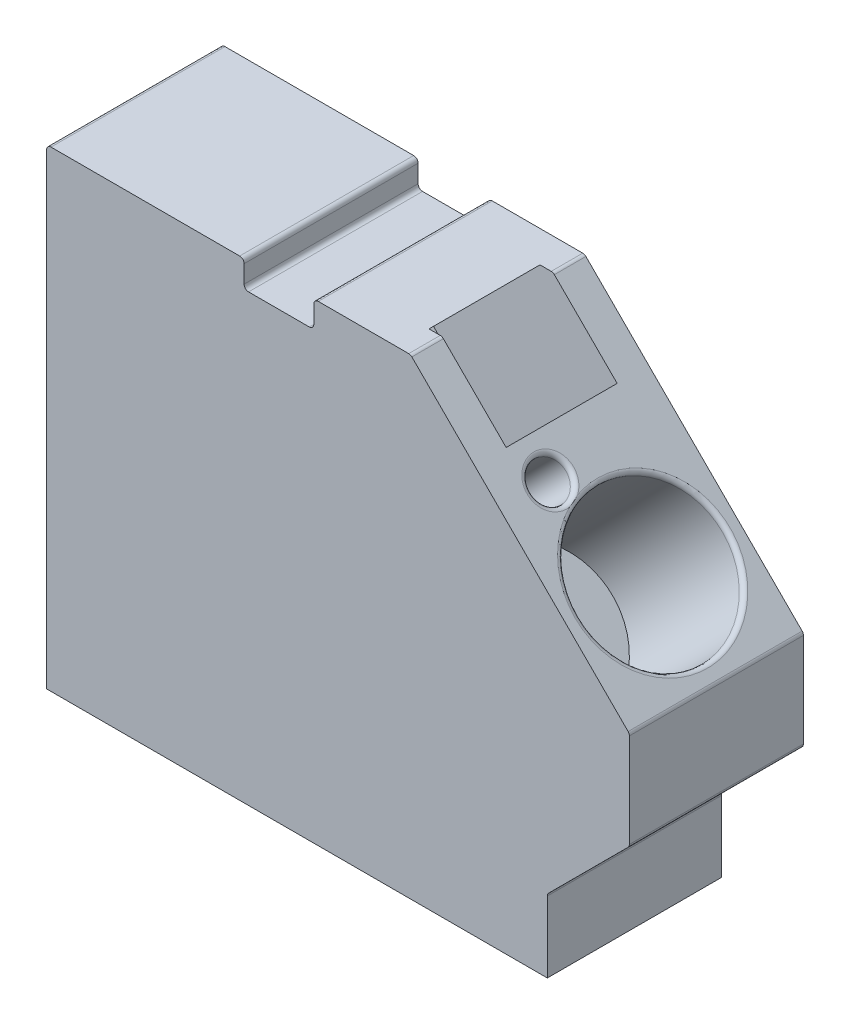
ISO-10303-21;
HEADER;
FILE_DESCRIPTION(('STEP AP214'),'2;1');
FILE_NAME('part.step','',(''),(''),'','','');
FILE_SCHEMA(('AUTOMOTIVE_DESIGN { 1 0 10303 214 1 1 1 1 }'));
ENDSEC;
DATA;
#1=APPLICATION_CONTEXT('core data for automotive mechanical design processes');
#2=APPLICATION_PROTOCOL_DEFINITION('international standard','automotive_design',2000,#1);
#3=PRODUCT_CONTEXT('',#1,'mechanical');
#4=PRODUCT('Part','Part','',(#3));
#5=PRODUCT_RELATED_PRODUCT_CATEGORY('part','',(#4));
#6=PRODUCT_DEFINITION_FORMATION('','',#4);
#7=PRODUCT_DEFINITION_CONTEXT('part definition',#1,'design');
#8=PRODUCT_DEFINITION('design','',#6,#7);
#9=PRODUCT_DEFINITION_SHAPE('','',#8);
#10=(LENGTH_UNIT() NAMED_UNIT(*) SI_UNIT(.MILLI.,.METRE.));
#11=(NAMED_UNIT(*) PLANE_ANGLE_UNIT() SI_UNIT($,.RADIAN.));
#12=(NAMED_UNIT(*) SI_UNIT($,.STERADIAN.) SOLID_ANGLE_UNIT());
#13=UNCERTAINTY_MEASURE_WITH_UNIT(LENGTH_MEASURE(1.E-05),#10,'distance_accuracy_value','');
#14=(GEOMETRIC_REPRESENTATION_CONTEXT(3) GLOBAL_UNCERTAINTY_ASSIGNED_CONTEXT((#13)) GLOBAL_UNIT_ASSIGNED_CONTEXT((#10,
#11,#12)) REPRESENTATION_CONTEXT('',''));
#15=CARTESIAN_POINT('',(0.,0.,0.));
#16=DIRECTION('',(0.,0.,1.));
#17=DIRECTION('',(1.,0.,0.));
#18=AXIS2_PLACEMENT_3D('',#15,#16,#17);
#19=CARTESIAN_POINT('',(20.7227897551572,26.7208,9.9568));
#20=DIRECTION('',(0.,0.,-1.));
#21=DIRECTION('',(-1.,0.,0.));
#22=AXIS2_PLACEMENT_3D('',#19,#20,#21);
#23=CYLINDRICAL_SURFACE('',#22,0.254000000000004);
#24=DIRECTION('',(0.,0.,-1.));
#25=VECTOR('',#24,1.);
#26=CARTESIAN_POINT('',(20.9023948775786,26.9004051224214,9.9568));
#27=LINE('',#26,#25);
#28=CARTESIAN_POINT('',(20.9023948775786,26.9004051224214,9.9568));
#29=VERTEX_POINT('',#28);
#30=CARTESIAN_POINT('',(20.9023948775786,26.9004051224214,8.1534));
#31=VERTEX_POINT('',#30);
#32=EDGE_CURVE('E399',#29,#31,#27,.T.);
#33=ORIENTED_EDGE('',*,*,#32,.T.);
#34=CARTESIAN_POINT('',(20.7227897551572,26.7208,8.1534));
#35=DIRECTION('',(0.,0.,1.));
#36=DIRECTION('',(1.,0.,0.));
#37=AXIS2_PLACEMENT_3D('',#34,#35,#36);
#38=CIRCLE('',#37,0.254000000000004);
#39=CARTESIAN_POINT('',(20.7227897551572,26.9748,8.1534));
#40=VERTEX_POINT('',#39);
#41=EDGE_CURVE('E268',#31,#40,#38,.T.);
#42=ORIENTED_EDGE('',*,*,#41,.T.);
#43=DIRECTION('',(0.,0.,-1.));
#44=VECTOR('',#43,1.);
#45=CARTESIAN_POINT('',(20.7227897551572,26.9748,9.9568));
#46=LINE('',#45,#44);
#47=CARTESIAN_POINT('',(20.7227897551572,26.9748,9.9568));
#48=VERTEX_POINT('',#47);
#49=EDGE_CURVE('E395',#48,#40,#46,.T.);
#50=ORIENTED_EDGE('',*,*,#49,.F.);
#51=CARTESIAN_POINT('',(20.7227897551572,26.7208,9.9568));
#52=DIRECTION('',(0.,0.,1.));
#53=DIRECTION('',(-1.,0.,0.));
#54=AXIS2_PLACEMENT_3D('',#51,#52,#53);
#55=CIRCLE('',#54,0.254000000000004);
#56=EDGE_CURVE('E296',#29,#48,#55,.T.);
#57=ORIENTED_EDGE('',*,*,#56,.F.);
#58=EDGE_LOOP('',(#33,#42,#50,#57));
#59=FACE_BOUND('',#58,.T.);
#60=ADVANCED_FACE('F36',(#59),#23,.T.);
#61=CARTESIAN_POINT('',(28.6532255816879,0.,9.9568));
#62=DIRECTION('',(0.,1.,0.));
#63=DIRECTION('',(-1.,0.,0.));
#64=AXIS2_PLACEMENT_3D('',#61,#62,#63);
#65=PLANE('',#64);
#66=DIRECTION('',(1.,0.,0.));
#67=VECTOR('',#66,1.);
#68=CARTESIAN_POINT('',(28.6532255816879,0.,0.));
#69=LINE('',#68,#67);
#70=CARTESIAN_POINT('',(0.,0.,0.));
#71=VERTEX_POINT('',#70);
#72=CARTESIAN_POINT('',(28.6532255816879,0.,0.));
#73=VERTEX_POINT('',#72);
#74=EDGE_CURVE('E277',#71,#73,#69,.T.);
#75=ORIENTED_EDGE('',*,*,#74,.T.);
#76=DIRECTION('',(0.,0.,-1.));
#77=VECTOR('',#76,1.);
#78=CARTESIAN_POINT('',(28.6532255816879,0.,9.9568));
#79=LINE('',#78,#77);
#80=CARTESIAN_POINT('',(28.6532255816879,0.,9.9568));
#81=VERTEX_POINT('',#80);
#82=EDGE_CURVE('E420',#81,#73,#79,.T.);
#83=ORIENTED_EDGE('',*,*,#82,.F.);
#84=DIRECTION('',(1.,0.,0.));
#85=VECTOR('',#84,1.);
#86=CARTESIAN_POINT('',(28.6532255816879,0.,9.9568));
#87=LINE('',#86,#85);
#88=CARTESIAN_POINT('',(0.,0.,9.9568));
#89=VERTEX_POINT('',#88);
#90=EDGE_CURVE('E278',#89,#81,#87,.T.);
#91=ORIENTED_EDGE('',*,*,#90,.F.);
#92=DIRECTION('',(0.,0.,-1.));
#93=VECTOR('',#92,1.);
#94=CARTESIAN_POINT('',(0.,0.,9.9568));
#95=LINE('',#94,#93);
#96=EDGE_CURVE('E320',#89,#71,#95,.T.);
#97=ORIENTED_EDGE('',*,*,#96,.T.);
#98=EDGE_LOOP('',(#75,#83,#91,#97));
#99=FACE_BOUND('',#98,.T.);
#100=ADVANCED_FACE('F457',(#99),#65,.F.);
#101=CARTESIAN_POINT('',(28.6532255816878,4.06241533684519,9.9568));
#102=DIRECTION('',(-1.,0.,0.));
#103=DIRECTION('',(0.,-1.,0.));
#104=AXIS2_PLACEMENT_3D('',#101,#102,#103);
#105=PLANE('',#104);
#106=DIRECTION('',(0.,1.,0.));
#107=VECTOR('',#106,1.);
#108=CARTESIAN_POINT('',(28.6532255816878,4.06241533684519,0.));
#109=LINE('',#108,#107);
#110=CARTESIAN_POINT('',(28.6532255816878,4.06241533684519,0.));
#111=VERTEX_POINT('',#110);
#112=EDGE_CURVE('E323',#73,#111,#109,.T.);
#113=ORIENTED_EDGE('',*,*,#112,.T.);
#114=DIRECTION('',(0.,0.,-1.));
#115=VECTOR('',#114,1.);
#116=CARTESIAN_POINT('',(28.6532255816878,4.06241533684519,9.9568));
#117=LINE('',#116,#115);
#118=CARTESIAN_POINT('',(28.6532255816878,4.06241533684519,9.9568));
#119=VERTEX_POINT('',#118);
#120=EDGE_CURVE('E417',#119,#111,#117,.T.);
#121=ORIENTED_EDGE('',*,*,#120,.F.);
#122=DIRECTION('',(0.,1.,0.));
#123=VECTOR('',#122,1.);
#124=CARTESIAN_POINT('',(28.6532255816878,4.06241533684519,9.9568));
#125=LINE('',#124,#123);
#126=EDGE_CURVE('E281',#81,#119,#125,.T.);
#127=ORIENTED_EDGE('',*,*,#126,.F.);
#128=ORIENTED_EDGE('',*,*,#82,.T.);
#129=EDGE_LOOP('',(#113,#121,#127,#128));
#130=FACE_BOUND('',#129,.T.);
#131=ADVANCED_FACE('F464',(#130),#105,.F.);
#132=CARTESIAN_POINT('',(28.9072255816879,4.06241533684512,9.9568));
#133=DIRECTION('',(0.,0.,-1.));
#134=DIRECTION('',(-1.,0.,0.));
#135=AXIS2_PLACEMENT_3D('',#132,#133,#134);
#136=CYLINDRICAL_SURFACE('',#135,0.254000000000088);
#137=CARTESIAN_POINT('',(28.9072255816879,4.06241533684512,0.));
#138=DIRECTION('',(0.,0.,-1.));
#139=DIRECTION('',(1.,0.,0.));
#140=AXIS2_PLACEMENT_3D('',#137,#138,#139);
#141=CIRCLE('',#140,0.254000000000088);
#142=CARTESIAN_POINT('',(28.7276204592665,4.24202045926658,0.));
#143=VERTEX_POINT('',#142);
#144=EDGE_CURVE('E325',#111,#143,#141,.T.);
#145=ORIENTED_EDGE('',*,*,#144,.T.);
#146=DIRECTION('',(0.,0.,-1.));
#147=VECTOR('',#146,1.);
#148=CARTESIAN_POINT('',(28.7276204592665,4.24202045926658,9.9568));
#149=LINE('',#148,#147);
#150=CARTESIAN_POINT('',(28.7276204592665,4.24202045926658,9.9568));
#151=VERTEX_POINT('',#150);
#152=EDGE_CURVE('E414',#151,#143,#149,.T.);
#153=ORIENTED_EDGE('',*,*,#152,.F.);
#154=CARTESIAN_POINT('',(28.9072255816879,4.06241533684512,9.9568));
#155=DIRECTION('',(0.,0.,-1.));
#156=DIRECTION('',(1.,0.,0.));
#157=AXIS2_PLACEMENT_3D('',#154,#155,#156);
#158=CIRCLE('',#157,0.254000000000088);
#159=EDGE_CURVE('E284',#119,#151,#158,.T.);
#160=ORIENTED_EDGE('',*,*,#159,.F.);
#161=ORIENTED_EDGE('',*,*,#120,.T.);
#162=EDGE_LOOP('',(#145,#153,#160,#161));
#163=FACE_BOUND('',#162,.T.);
#164=ADVANCED_FACE('F534',(#163),#136,.F.);
#165=CARTESIAN_POINT('',(33.2758051224214,8.79020512242134,9.9568));
#166=DIRECTION('',(-0.707106781186535,0.70710678118656,0.));
#167=DIRECTION('',(-0.70710678118656,-0.707106781186535,0.));
#168=AXIS2_PLACEMENT_3D('',#165,#166,#167);
#169=PLANE('',#168);
#170=DIRECTION('',(0.70710678118656,0.707106781186535,0.));
#171=VECTOR('',#170,1.);
#172=CARTESIAN_POINT('',(33.2758051224214,8.79020512242134,0.));
#173=LINE('',#172,#171);
#174=CARTESIAN_POINT('',(33.2758051224214,8.79020512242134,0.));
#175=VERTEX_POINT('',#174);
#176=EDGE_CURVE('E327',#143,#175,#173,.T.);
#177=ORIENTED_EDGE('',*,*,#176,.T.);
#178=DIRECTION('',(0.,0.,-1.));
#179=VECTOR('',#178,1.);
#180=CARTESIAN_POINT('',(33.2758051224214,8.79020512242134,9.9568));
#181=LINE('',#180,#179);
#182=CARTESIAN_POINT('',(33.2758051224214,8.79020512242134,9.9568));
#183=VERTEX_POINT('',#182);
#184=EDGE_CURVE('E411',#183,#175,#181,.T.);
#185=ORIENTED_EDGE('',*,*,#184,.F.);
#186=DIRECTION('',(0.70710678118656,0.707106781186535,0.));
#187=VECTOR('',#186,1.);
#188=CARTESIAN_POINT('',(33.2758051224214,8.79020512242134,9.9568));
#189=LINE('',#188,#187);
#190=EDGE_CURVE('E286',#151,#183,#189,.T.);
#191=ORIENTED_EDGE('',*,*,#190,.F.);
#192=ORIENTED_EDGE('',*,*,#152,.T.);
#193=EDGE_LOOP('',(#177,#185,#191,#192));
#194=FACE_BOUND('',#193,.T.);
#195=ADVANCED_FACE('F530',(#194),#169,.F.);
#196=CARTESIAN_POINT('',(33.0962,8.96981024484272,9.9568));
#197=DIRECTION('',(0.,0.,-1.));
#198=DIRECTION('',(-1.,0.,0.));
#199=AXIS2_PLACEMENT_3D('',#196,#197,#198);
#200=CYLINDRICAL_SURFACE('',#199,0.253999999999998);
#201=CARTESIAN_POINT('',(33.0962,8.96981024484272,0.));
#202=DIRECTION('',(0.,0.,1.));
#203=DIRECTION('',(-1.,0.,0.));
#204=AXIS2_PLACEMENT_3D('',#201,#202,#203);
#205=CIRCLE('',#204,0.253999999999998);
#206=CARTESIAN_POINT('',(33.3502,8.96981024484272,0.));
#207=VERTEX_POINT('',#206);
#208=EDGE_CURVE('E329',#175,#207,#205,.T.);
#209=ORIENTED_EDGE('',*,*,#208,.T.);
#210=DIRECTION('',(0.,0.,-1.));
#211=VECTOR('',#210,1.);
#212=CARTESIAN_POINT('',(33.3502,8.96981024484272,9.9568));
#213=LINE('',#212,#211);
#214=CARTESIAN_POINT('',(33.3502,8.96981024484272,9.9568));
#215=VERTEX_POINT('',#214);
#216=EDGE_CURVE('E408',#215,#207,#213,.T.);
#217=ORIENTED_EDGE('',*,*,#216,.F.);
#218=CARTESIAN_POINT('',(33.0962,8.96981024484272,9.9568));
#219=DIRECTION('',(0.,0.,1.));
#220=DIRECTION('',(-1.,0.,0.));
#221=AXIS2_PLACEMENT_3D('',#218,#219,#220);
#222=CIRCLE('',#221,0.253999999999998);
#223=EDGE_CURVE('E288',#183,#215,#222,.T.);
#224=ORIENTED_EDGE('',*,*,#223,.F.);
#225=ORIENTED_EDGE('',*,*,#184,.T.);
#226=EDGE_LOOP('',(#209,#217,#224,#225));
#227=FACE_BOUND('',#226,.T.);
#228=ADVANCED_FACE('F526',(#227),#200,.T.);
#229=CARTESIAN_POINT('',(33.3502,14.3473897551572,9.9568));
#230=DIRECTION('',(-1.,0.,0.));
#231=DIRECTION('',(0.,-1.,0.));
#232=AXIS2_PLACEMENT_3D('',#229,#230,#231);
#233=PLANE('',#232);
#234=DIRECTION('',(0.,1.,0.));
#235=VECTOR('',#234,1.);
#236=CARTESIAN_POINT('',(33.3502,14.3473897551572,0.));
#237=LINE('',#236,#235);
#238=CARTESIAN_POINT('',(33.3502,14.3473897551572,0.));
#239=VERTEX_POINT('',#238);
#240=EDGE_CURVE('E331',#207,#239,#237,.T.);
#241=ORIENTED_EDGE('',*,*,#240,.T.);
#242=DIRECTION('',(0.,0.,-1.));
#243=VECTOR('',#242,1.);
#244=CARTESIAN_POINT('',(33.3502,14.3473897551572,9.9568));
#245=LINE('',#244,#243);
#246=CARTESIAN_POINT('',(33.3502,14.3473897551572,9.9568));
#247=VERTEX_POINT('',#246);
#248=EDGE_CURVE('E405',#247,#239,#245,.T.);
#249=ORIENTED_EDGE('',*,*,#248,.F.);
#250=DIRECTION('',(0.,1.,0.));
#251=VECTOR('',#250,1.);
#252=CARTESIAN_POINT('',(33.3502,14.3473897551572,9.9568));
#253=LINE('',#252,#251);
#254=EDGE_CURVE('E290',#215,#247,#253,.T.);
#255=ORIENTED_EDGE('',*,*,#254,.F.);
#256=ORIENTED_EDGE('',*,*,#216,.T.);
#257=EDGE_LOOP('',(#241,#249,#255,#256));
#258=FACE_BOUND('',#257,.T.);
#259=ADVANCED_FACE('F522',(#258),#233,.F.);
#260=CARTESIAN_POINT('',(33.0962,14.3473897551572,9.9568));
#261=DIRECTION('',(0.,0.,-1.));
#262=DIRECTION('',(-1.,0.,0.));
#263=AXIS2_PLACEMENT_3D('',#260,#261,#262);
#264=CYLINDRICAL_SURFACE('',#263,0.253999999999995);
#265=CARTESIAN_POINT('',(33.0962,14.3473897551572,0.));
#266=DIRECTION('',(0.,0.,1.));
#267=DIRECTION('',(-1.,0.,0.));
#268=AXIS2_PLACEMENT_3D('',#265,#266,#267);
#269=CIRCLE('',#268,0.253999999999995);
#270=CARTESIAN_POINT('',(33.2758051224214,14.5269948775786,0.));
#271=VERTEX_POINT('',#270);
#272=EDGE_CURVE('E333',#239,#271,#269,.T.);
#273=ORIENTED_EDGE('',*,*,#272,.T.);
#274=DIRECTION('',(0.,0.,-1.));
#275=VECTOR('',#274,1.);
#276=CARTESIAN_POINT('',(33.2758051224214,14.5269948775786,9.9568));
#277=LINE('',#276,#275);
#278=CARTESIAN_POINT('',(33.2758051224214,14.5269948775786,9.9568));
#279=VERTEX_POINT('',#278);
#280=EDGE_CURVE('E402',#279,#271,#277,.T.);
#281=ORIENTED_EDGE('',*,*,#280,.F.);
#282=CARTESIAN_POINT('',(33.0962,14.3473897551572,9.9568));
#283=DIRECTION('',(0.,0.,1.));
#284=DIRECTION('',(-1.,0.,0.));
#285=AXIS2_PLACEMENT_3D('',#282,#283,#284);
#286=CIRCLE('',#285,0.253999999999995);
#287=EDGE_CURVE('E292',#247,#279,#286,.T.);
#288=ORIENTED_EDGE('',*,*,#287,.F.);
#289=ORIENTED_EDGE('',*,*,#248,.T.);
#290=EDGE_LOOP('',(#273,#281,#288,#289));
#291=FACE_BOUND('',#290,.T.);
#292=ADVANCED_FACE('F478',(#291),#264,.T.);
#293=CARTESIAN_POINT('',(20.9023948775786,26.9004051224214,9.9568));
#294=DIRECTION('',(-0.707106781186549,-0.707106781186546,0.));
#295=DIRECTION('',(0.707106781186546,-0.707106781186549,0.));
#296=AXIS2_PLACEMENT_3D('',#293,#294,#295);
#297=PLANE('',#296);
#298=CARTESIAN_POINT('',(25.9433846714102,21.8594153285898,7.0739));
#299=DIRECTION('',(-0.707106781186549,-0.707106781186546,0.));
#300=DIRECTION('',(0.707106781186546,-0.707106781186549,0.));
#301=AXIS2_PLACEMENT_3D('',#298,#299,#300);
#302=CIRCLE('',#301,1.3335);
#303=CARTESIAN_POINT('',(25.0004577786979,22.8023422213021,7.0739));
#304=VERTEX_POINT('',#303);
#305=CARTESIAN_POINT('',(26.6954842905343,21.1073157094657,6.26959000016992));
#306=VERTEX_POINT('',#305);
#307=EDGE_CURVE('E435',#304,#306,#302,.T.);
#308=ORIENTED_EDGE('',*,*,#307,.T.);
#309=CARTESIAN_POINT('',(29.7030458762264,18.0997541237736,4.9784));
#310=DIRECTION('',(-0.707106781186549,-0.707106781186546,0.));
#311=DIRECTION('',(0.707106781186546,-0.707106781186549,0.));
#312=AXIS2_PLACEMENT_3D('',#309,#310,#311);
#313=CIRCLE('',#312,4.445);
#314=CARTESIAN_POINT('',(26.5599562338522,21.2428437661478,4.9784));
#315=VERTEX_POINT('',#314);
#316=EDGE_CURVE('E49',#306,#315,#313,.T.);
#317=ORIENTED_EDGE('',*,*,#316,.T.);
#318=CARTESIAN_POINT('',(29.7030458762264,18.0997541237736,4.9784));
#319=DIRECTION('',(-0.707106781186549,-0.707106781186546,0.));
#320=DIRECTION('',(0.707106781186546,-0.707106781186549,0.));
#321=AXIS2_PLACEMENT_3D('',#318,#319,#320);
#322=CIRCLE('',#321,4.445);
#323=CARTESIAN_POINT('',(26.8812759716361,20.9215240283638,6.9362698146449));
#324=VERTEX_POINT('',#323);
#325=EDGE_CURVE('E56',#315,#324,#322,.T.);
#326=ORIENTED_EDGE('',*,*,#325,.T.);
#327=CARTESIAN_POINT('',(25.9433846714102,21.8594153285898,7.0739));
#328=DIRECTION('',(-0.707106781186549,-0.707106781186546,0.));
#329=DIRECTION('',(0.707106781186546,-0.707106781186549,0.));
#330=AXIS2_PLACEMENT_3D('',#327,#328,#329);
#331=CIRCLE('',#330,1.3335);
#332=EDGE_CURVE('E437',#324,#304,#331,.T.);
#333=ORIENTED_EDGE('',*,*,#332,.T.);
#334=EDGE_LOOP('',(#308,#317,#326,#333));
#335=FACE_BOUND('',#334,.T.);
#336=DIRECTION('',(0.,0.,-1.));
#337=VECTOR('',#336,1.);
#338=CARTESIAN_POINT('',(24.4944973260063,23.3083026739937,8.1534));
#339=LINE('',#338,#337);
#340=CARTESIAN_POINT('',(24.4944973260063,23.3083026739937,8.1534));
#341=VERTEX_POINT('',#340);
#342=CARTESIAN_POINT('',(24.4944973260063,23.3083026739937,1.8034));
#343=VERTEX_POINT('',#342);
#344=EDGE_CURVE('E252',#341,#343,#339,.T.);
#345=ORIENTED_EDGE('',*,*,#344,.F.);
#346=DIRECTION('',(0.707106781186546,-0.707106781186549,0.));
#347=VECTOR('',#346,1.);
#348=CARTESIAN_POINT('',(20.4533820715252,27.3494179284748,8.1534));
#349=LINE('',#348,#347);
#350=EDGE_CURVE('E233',#31,#341,#349,.T.);
#351=ORIENTED_EDGE('',*,*,#350,.F.);
#352=ORIENTED_EDGE('',*,*,#32,.F.);
#353=DIRECTION('',(-0.707106781186546,0.707106781186549,0.));
#354=VECTOR('',#353,1.);
#355=CARTESIAN_POINT('',(20.9023948775786,26.9004051224214,9.9568));
#356=LINE('',#355,#354);
#357=EDGE_CURVE('E294',#279,#29,#356,.T.);
#358=ORIENTED_EDGE('',*,*,#357,.F.);
#359=ORIENTED_EDGE('',*,*,#280,.T.);
#360=DIRECTION('',(-0.707106781186546,0.707106781186549,0.));
#361=VECTOR('',#360,1.);
#362=CARTESIAN_POINT('',(20.9023948775786,26.9004051224214,0.));
#363=LINE('',#362,#361);
#364=CARTESIAN_POINT('',(20.9023948775786,26.9004051224214,0.));
#365=VERTEX_POINT('',#364);
#366=EDGE_CURVE('E335',#271,#365,#363,.T.);
#367=ORIENTED_EDGE('',*,*,#366,.T.);
#368=CARTESIAN_POINT('',(20.9023948775786,26.9004051224214,1.8034));
#369=VERTEX_POINT('',#368);
#370=EDGE_CURVE('E398',#369,#365,#27,.T.);
#371=ORIENTED_EDGE('',*,*,#370,.F.);
#372=DIRECTION('',(-0.707106781186546,0.707106781186549,0.));
#373=VECTOR('',#372,1.);
#374=CARTESIAN_POINT('',(20.4533820715252,27.3494179284748,1.8034));
#375=LINE('',#374,#373);
#376=EDGE_CURVE('E250',#343,#369,#375,.T.);
#377=ORIENTED_EDGE('',*,*,#376,.F.);
#378=EDGE_LOOP('',(#345,#351,#352,#358,#359,#367,#371,#377));
#379=FACE_BOUND('',#378,.T.);
#380=ADVANCED_FACE('F440',(#335,#379),#297,.F.);
#381=CARTESIAN_POINT('',(20.7227897551572,26.9748,1.8034));
#382=VERTEX_POINT('',#381);
#383=CARTESIAN_POINT('',(20.7227897551572,26.9748,0.));
#384=VERTEX_POINT('',#383);
#385=EDGE_CURVE('E394',#382,#384,#46,.T.);
#386=ORIENTED_EDGE('',*,*,#385,.F.);
#387=CARTESIAN_POINT('',(20.7227897551572,26.7208,1.8034));
#388=DIRECTION('',(0.,0.,-1.));
#389=DIRECTION('',(0.,1.,0.));
#390=AXIS2_PLACEMENT_3D('',#387,#388,#389);
#391=CIRCLE('',#390,0.254000000000004);
#392=EDGE_CURVE('E261',#382,#369,#391,.T.);
#393=ORIENTED_EDGE('',*,*,#392,.T.);
#394=ORIENTED_EDGE('',*,*,#370,.T.);
#395=CARTESIAN_POINT('',(20.7227897551572,26.7208,0.));
#396=DIRECTION('',(0.,0.,1.));
#397=DIRECTION('',(-1.,0.,0.));
#398=AXIS2_PLACEMENT_3D('',#395,#396,#397);
#399=CIRCLE('',#398,0.254000000000004);
#400=EDGE_CURVE('E338',#365,#384,#399,.T.);
#401=ORIENTED_EDGE('',*,*,#400,.T.);
#402=EDGE_LOOP('',(#386,#393,#394,#401));
#403=FACE_BOUND('',#402,.T.);
#404=ADVANCED_FACE('F460',(#403),#23,.T.);
#405=CARTESIAN_POINT('',(15.5448,26.9748,9.9568));
#406=DIRECTION('',(0.,-1.,0.));
#407=DIRECTION('',(1.,0.,0.));
#408=AXIS2_PLACEMENT_3D('',#405,#406,#407);
#409=PLANE('',#408);
#410=ORIENTED_EDGE('',*,*,#49,.T.);
#411=DIRECTION('',(-1.,0.,0.));
#412=VECTOR('',#411,1.);
#413=CARTESIAN_POINT('',(15.5448,26.9748,8.1534));
#414=LINE('',#413,#412);
#415=CARTESIAN_POINT('',(20.0787641430503,26.9748,8.1534));
#416=VERTEX_POINT('',#415);
#417=EDGE_CURVE('E429',#40,#416,#414,.T.);
#418=ORIENTED_EDGE('',*,*,#417,.T.);
#419=DIRECTION('',(0.,0.,-1.));
#420=VECTOR('',#419,1.);
#421=CARTESIAN_POINT('',(20.0787641430503,26.9748,9.9568));
#422=LINE('',#421,#420);
#423=CARTESIAN_POINT('',(20.0787641430503,26.9748,1.8034));
#424=VERTEX_POINT('',#423);
#425=EDGE_CURVE('E426',#416,#424,#422,.T.);
#426=ORIENTED_EDGE('',*,*,#425,.T.);
#427=DIRECTION('',(1.,0.,0.));
#428=VECTOR('',#427,1.);
#429=CARTESIAN_POINT('',(15.5448,26.9748,1.8034));
#430=LINE('',#429,#428);
#431=EDGE_CURVE('E423',#424,#382,#430,.T.);
#432=ORIENTED_EDGE('',*,*,#431,.T.);
#433=ORIENTED_EDGE('',*,*,#385,.T.);
#434=DIRECTION('',(-1.,0.,0.));
#435=VECTOR('',#434,1.);
#436=CARTESIAN_POINT('',(15.5448,26.9748,0.));
#437=LINE('',#436,#435);
#438=CARTESIAN_POINT('',(15.5448,26.9748,0.));
#439=VERTEX_POINT('',#438);
#440=EDGE_CURVE('E341',#384,#439,#437,.T.);
#441=ORIENTED_EDGE('',*,*,#440,.T.);
#442=DIRECTION('',(0.,0.,-1.));
#443=VECTOR('',#442,1.);
#444=CARTESIAN_POINT('',(15.5448,26.9748,9.9568));
#445=LINE('',#444,#443);
#446=CARTESIAN_POINT('',(15.5448,26.9748,9.9568));
#447=VERTEX_POINT('',#446);
#448=EDGE_CURVE('E391',#447,#439,#445,.T.);
#449=ORIENTED_EDGE('',*,*,#448,.F.);
#450=DIRECTION('',(-1.,0.,0.));
#451=VECTOR('',#450,1.);
#452=CARTESIAN_POINT('',(15.5448,26.9748,9.9568));
#453=LINE('',#452,#451);
#454=EDGE_CURVE('E298',#48,#447,#453,.T.);
#455=ORIENTED_EDGE('',*,*,#454,.F.);
#456=EDGE_LOOP('',(#410,#418,#426,#432,#433,#441,#449,#455));
#457=FACE_BOUND('',#456,.T.);
#458=ADVANCED_FACE('F470',(#457),#409,.F.);
#459=CARTESIAN_POINT('',(15.5448,26.7208,9.9568));
#460=DIRECTION('',(0.,0.,-1.));
#461=DIRECTION('',(-1.,0.,0.));
#462=AXIS2_PLACEMENT_3D('',#459,#460,#461);
#463=CYLINDRICAL_SURFACE('',#462,0.254000000000001);
#464=CARTESIAN_POINT('',(15.5448,26.7208,0.));
#465=DIRECTION('',(0.,0.,1.));
#466=DIRECTION('',(1.,0.,0.));
#467=AXIS2_PLACEMENT_3D('',#464,#465,#466);
#468=CIRCLE('',#467,0.254000000000001);
#469=CARTESIAN_POINT('',(15.2908,26.7208,0.));
#470=VERTEX_POINT('',#469);
#471=EDGE_CURVE('E343',#439,#470,#468,.T.);
#472=ORIENTED_EDGE('',*,*,#471,.T.);
#473=DIRECTION('',(0.,0.,-1.));
#474=VECTOR('',#473,1.);
#475=CARTESIAN_POINT('',(15.2908,26.7208,9.9568));
#476=LINE('',#475,#474);
#477=CARTESIAN_POINT('',(15.2908,26.7208,9.9568));
#478=VERTEX_POINT('',#477);
#479=EDGE_CURVE('E388',#478,#470,#476,.T.);
#480=ORIENTED_EDGE('',*,*,#479,.F.);
#481=CARTESIAN_POINT('',(15.5448,26.7208,9.9568));
#482=DIRECTION('',(0.,0.,1.));
#483=DIRECTION('',(1.,0.,0.));
#484=AXIS2_PLACEMENT_3D('',#481,#482,#483);
#485=CIRCLE('',#484,0.254000000000001);
#486=EDGE_CURVE('E300',#447,#478,#485,.T.);
#487=ORIENTED_EDGE('',*,*,#486,.F.);
#488=ORIENTED_EDGE('',*,*,#448,.T.);
#489=EDGE_LOOP('',(#472,#480,#487,#488));
#490=FACE_BOUND('',#489,.T.);
#491=ADVANCED_FACE('F476',(#490),#463,.T.);
#492=CARTESIAN_POINT('',(15.2908,26.7208,9.9568));
#493=DIRECTION('',(1.,0.,0.));
#494=DIRECTION('',(0.,0.,-1.));
#495=AXIS2_PLACEMENT_3D('',#492,#493,#494);
#496=PLANE('',#495);
#497=DIRECTION('',(0.,-1.,0.));
#498=VECTOR('',#497,1.);
#499=CARTESIAN_POINT('',(15.2908,26.7208,0.));
#500=LINE('',#499,#498);
#501=CARTESIAN_POINT('',(15.2908,25.7048,0.));
#502=VERTEX_POINT('',#501);
#503=EDGE_CURVE('E345',#470,#502,#500,.T.);
#504=ORIENTED_EDGE('',*,*,#503,.T.);
#505=DIRECTION('',(0.,0.,-1.));
#506=VECTOR('',#505,1.);
#507=CARTESIAN_POINT('',(15.2908,25.7048,9.9568));
#508=LINE('',#507,#506);
#509=CARTESIAN_POINT('',(15.2908,25.7048,9.9568));
#510=VERTEX_POINT('',#509);
#511=EDGE_CURVE('E385',#510,#502,#508,.T.);
#512=ORIENTED_EDGE('',*,*,#511,.F.);
#513=DIRECTION('',(0.,-1.,0.));
#514=VECTOR('',#513,1.);
#515=CARTESIAN_POINT('',(15.2908,26.7208,9.9568));
#516=LINE('',#515,#514);
#517=EDGE_CURVE('E302',#478,#510,#516,.T.);
#518=ORIENTED_EDGE('',*,*,#517,.F.);
#519=ORIENTED_EDGE('',*,*,#479,.T.);
#520=EDGE_LOOP('',(#504,#512,#518,#519));
#521=FACE_BOUND('',#520,.T.);
#522=ADVANCED_FACE('F508',(#521),#496,.F.);
#523=CARTESIAN_POINT('',(15.0368,25.7048,9.9568));
#524=DIRECTION('',(0.,0.,-1.));
#525=DIRECTION('',(-1.,0.,0.));
#526=AXIS2_PLACEMENT_3D('',#523,#524,#525);
#527=CYLINDRICAL_SURFACE('',#526,0.254000000000001);
#528=CARTESIAN_POINT('',(15.0368,25.7048,0.));
#529=DIRECTION('',(0.,0.,-1.));
#530=DIRECTION('',(1.,0.,0.));
#531=AXIS2_PLACEMENT_3D('',#528,#529,#530);
#532=CIRCLE('',#531,0.254000000000001);
#533=CARTESIAN_POINT('',(15.0368,25.4508,0.));
#534=VERTEX_POINT('',#533);
#535=EDGE_CURVE('E347',#502,#534,#532,.T.);
#536=ORIENTED_EDGE('',*,*,#535,.T.);
#537=DIRECTION('',(0.,0.,-1.));
#538=VECTOR('',#537,1.);
#539=CARTESIAN_POINT('',(15.0368,25.4508,9.9568));
#540=LINE('',#539,#538);
#541=CARTESIAN_POINT('',(15.0368,25.4508,9.9568));
#542=VERTEX_POINT('',#541);
#543=EDGE_CURVE('E382',#542,#534,#540,.T.);
#544=ORIENTED_EDGE('',*,*,#543,.F.);
#545=CARTESIAN_POINT('',(15.0368,25.7048,9.9568));
#546=DIRECTION('',(0.,0.,-1.));
#547=DIRECTION('',(1.,0.,0.));
#548=AXIS2_PLACEMENT_3D('',#545,#546,#547);
#549=CIRCLE('',#548,0.254000000000001);
#550=EDGE_CURVE('E304',#510,#542,#549,.T.);
#551=ORIENTED_EDGE('',*,*,#550,.F.);
#552=ORIENTED_EDGE('',*,*,#511,.T.);
#553=EDGE_LOOP('',(#536,#544,#551,#552));
#554=FACE_BOUND('',#553,.T.);
#555=ADVANCED_FACE('F576',(#554),#527,.F.);
#556=CARTESIAN_POINT('',(11.557,25.4508,9.9568));
#557=DIRECTION('',(0.,-1.,0.));
#558=DIRECTION('',(0.,0.,-1.));
#559=AXIS2_PLACEMENT_3D('',#556,#557,#558);
#560=PLANE('',#559);
#561=DIRECTION('',(-1.,0.,0.));
#562=VECTOR('',#561,1.);
#563=CARTESIAN_POINT('',(11.557,25.4508,0.));
#564=LINE('',#563,#562);
#565=CARTESIAN_POINT('',(11.557,25.4508,0.));
#566=VERTEX_POINT('',#565);
#567=EDGE_CURVE('E349',#534,#566,#564,.T.);
#568=ORIENTED_EDGE('',*,*,#567,.T.);
#569=DIRECTION('',(0.,0.,-1.));
#570=VECTOR('',#569,1.);
#571=CARTESIAN_POINT('',(11.557,25.4508,9.9568));
#572=LINE('',#571,#570);
#573=CARTESIAN_POINT('',(11.557,25.4508,9.9568));
#574=VERTEX_POINT('',#573);
#575=EDGE_CURVE('E379',#574,#566,#572,.T.);
#576=ORIENTED_EDGE('',*,*,#575,.F.);
#577=DIRECTION('',(-1.,0.,0.));
#578=VECTOR('',#577,1.);
#579=CARTESIAN_POINT('',(11.557,25.4508,9.9568));
#580=LINE('',#579,#578);
#581=EDGE_CURVE('E306',#542,#574,#580,.T.);
#582=ORIENTED_EDGE('',*,*,#581,.F.);
#583=ORIENTED_EDGE('',*,*,#543,.T.);
#584=EDGE_LOOP('',(#568,#576,#582,#583));
#585=FACE_BOUND('',#584,.T.);
#586=ADVANCED_FACE('F573',(#585),#560,.F.);
#587=CARTESIAN_POINT('',(11.557,25.7048,9.9568));
#588=DIRECTION('',(0.,0.,-1.));
#589=DIRECTION('',(-1.,0.,0.));
#590=AXIS2_PLACEMENT_3D('',#587,#588,#589);
#591=CYLINDRICAL_SURFACE('',#590,0.254000000000001);
#592=CARTESIAN_POINT('',(11.557,25.7048,0.));
#593=DIRECTION('',(0.,0.,-1.));
#594=DIRECTION('',(1.,0.,0.));
#595=AXIS2_PLACEMENT_3D('',#592,#593,#594);
#596=CIRCLE('',#595,0.254000000000001);
#597=CARTESIAN_POINT('',(11.303,25.7048,0.));
#598=VERTEX_POINT('',#597);
#599=EDGE_CURVE('E351',#566,#598,#596,.T.);
#600=ORIENTED_EDGE('',*,*,#599,.T.);
#601=DIRECTION('',(0.,0.,-1.));
#602=VECTOR('',#601,1.);
#603=CARTESIAN_POINT('',(11.303,25.7048,9.9568));
#604=LINE('',#603,#602);
#605=CARTESIAN_POINT('',(11.303,25.7048,9.9568));
#606=VERTEX_POINT('',#605);
#607=EDGE_CURVE('E376',#606,#598,#604,.T.);
#608=ORIENTED_EDGE('',*,*,#607,.F.);
#609=CARTESIAN_POINT('',(11.557,25.7048,9.9568));
#610=DIRECTION('',(0.,0.,-1.));
#611=DIRECTION('',(1.,0.,0.));
#612=AXIS2_PLACEMENT_3D('',#609,#610,#611);
#613=CIRCLE('',#612,0.254000000000001);
#614=EDGE_CURVE('E308',#574,#606,#613,.T.);
#615=ORIENTED_EDGE('',*,*,#614,.F.);
#616=ORIENTED_EDGE('',*,*,#575,.T.);
#617=EDGE_LOOP('',(#600,#608,#615,#616));
#618=FACE_BOUND('',#617,.T.);
#619=ADVANCED_FACE('F569',(#618),#591,.F.);
#620=CARTESIAN_POINT('',(11.303,26.7208,9.9568));
#621=DIRECTION('',(-1.,0.,0.));
#622=DIRECTION('',(0.,0.,1.));
#623=AXIS2_PLACEMENT_3D('',#620,#621,#622);
#624=PLANE('',#623);
#625=DIRECTION('',(0.,1.,0.));
#626=VECTOR('',#625,1.);
#627=CARTESIAN_POINT('',(11.303,26.7208,0.));
#628=LINE('',#627,#626);
#629=CARTESIAN_POINT('',(11.303,26.7208,0.));
#630=VERTEX_POINT('',#629);
#631=EDGE_CURVE('E353',#598,#630,#628,.T.);
#632=ORIENTED_EDGE('',*,*,#631,.T.);
#633=DIRECTION('',(0.,0.,-1.));
#634=VECTOR('',#633,1.);
#635=CARTESIAN_POINT('',(11.303,26.7208,9.9568));
#636=LINE('',#635,#634);
#637=CARTESIAN_POINT('',(11.303,26.7208,9.9568));
#638=VERTEX_POINT('',#637);
#639=EDGE_CURVE('E373',#638,#630,#636,.T.);
#640=ORIENTED_EDGE('',*,*,#639,.F.);
#641=DIRECTION('',(0.,1.,0.));
#642=VECTOR('',#641,1.);
#643=CARTESIAN_POINT('',(11.303,26.7208,9.9568));
#644=LINE('',#643,#642);
#645=EDGE_CURVE('E310',#606,#638,#644,.T.);
#646=ORIENTED_EDGE('',*,*,#645,.F.);
#647=ORIENTED_EDGE('',*,*,#607,.T.);
#648=EDGE_LOOP('',(#632,#640,#646,#647));
#649=FACE_BOUND('',#648,.T.);
#650=ADVANCED_FACE('F565',(#649),#624,.F.);
#651=CARTESIAN_POINT('',(11.049,26.7208,9.9568));
#652=DIRECTION('',(0.,0.,-1.));
#653=DIRECTION('',(-1.,0.,0.));
#654=AXIS2_PLACEMENT_3D('',#651,#652,#653);
#655=CYLINDRICAL_SURFACE('',#654,0.254000000000001);
#656=CARTESIAN_POINT('',(11.049,26.7208,0.));
#657=DIRECTION('',(0.,0.,1.));
#658=DIRECTION('',(-1.,0.,0.));
#659=AXIS2_PLACEMENT_3D('',#656,#657,#658);
#660=CIRCLE('',#659,0.254000000000001);
#661=CARTESIAN_POINT('',(11.049,26.9748,0.));
#662=VERTEX_POINT('',#661);
#663=EDGE_CURVE('E355',#630,#662,#660,.T.);
#664=ORIENTED_EDGE('',*,*,#663,.T.);
#665=DIRECTION('',(0.,0.,-1.));
#666=VECTOR('',#665,1.);
#667=CARTESIAN_POINT('',(11.049,26.9748,9.9568));
#668=LINE('',#667,#666);
#669=CARTESIAN_POINT('',(11.049,26.9748,9.9568));
#670=VERTEX_POINT('',#669);
#671=EDGE_CURVE('E370',#670,#662,#668,.T.);
#672=ORIENTED_EDGE('',*,*,#671,.F.);
#673=CARTESIAN_POINT('',(11.049,26.7208,9.9568));
#674=DIRECTION('',(0.,0.,1.));
#675=DIRECTION('',(-1.,0.,0.));
#676=AXIS2_PLACEMENT_3D('',#673,#674,#675);
#677=CIRCLE('',#676,0.254000000000001);
#678=EDGE_CURVE('E312',#638,#670,#677,.T.);
#679=ORIENTED_EDGE('',*,*,#678,.F.);
#680=ORIENTED_EDGE('',*,*,#639,.T.);
#681=EDGE_LOOP('',(#664,#672,#679,#680));
#682=FACE_BOUND('',#681,.T.);
#683=ADVANCED_FACE('F560',(#682),#655,.T.);
#684=CARTESIAN_POINT('',(0.254000000000002,26.9748,9.9568));
#685=DIRECTION('',(0.,-1.,0.));
#686=DIRECTION('',(1.,0.,0.));
#687=AXIS2_PLACEMENT_3D('',#684,#685,#686);
#688=PLANE('',#687);
#689=DIRECTION('',(-1.,0.,0.));
#690=VECTOR('',#689,1.);
#691=CARTESIAN_POINT('',(0.254000000000002,26.9748,0.));
#692=LINE('',#691,#690);
#693=CARTESIAN_POINT('',(0.254000000000002,26.9748,0.));
#694=VERTEX_POINT('',#693);
#695=EDGE_CURVE('E357',#662,#694,#692,.T.);
#696=ORIENTED_EDGE('',*,*,#695,.T.);
#697=DIRECTION('',(0.,0.,-1.));
#698=VECTOR('',#697,1.);
#699=CARTESIAN_POINT('',(0.254000000000002,26.9748,9.9568));
#700=LINE('',#699,#698);
#701=CARTESIAN_POINT('',(0.254000000000002,26.9748,9.9568));
#702=VERTEX_POINT('',#701);
#703=EDGE_CURVE('E367',#702,#694,#700,.T.);
#704=ORIENTED_EDGE('',*,*,#703,.F.);
#705=DIRECTION('',(-1.,0.,0.));
#706=VECTOR('',#705,1.);
#707=CARTESIAN_POINT('',(0.254000000000002,26.9748,9.9568));
#708=LINE('',#707,#706);
#709=EDGE_CURVE('E314',#670,#702,#708,.T.);
#710=ORIENTED_EDGE('',*,*,#709,.F.);
#711=ORIENTED_EDGE('',*,*,#671,.T.);
#712=EDGE_LOOP('',(#696,#704,#710,#711));
#713=FACE_BOUND('',#712,.T.);
#714=ADVANCED_FACE('F554',(#713),#688,.F.);
#715=CARTESIAN_POINT('',(0.254,26.7208,9.9568));
#716=DIRECTION('',(0.,0.,-1.));
#717=DIRECTION('',(-1.,0.,0.));
#718=AXIS2_PLACEMENT_3D('',#715,#716,#717);
#719=CYLINDRICAL_SURFACE('',#718,0.254);
#720=CARTESIAN_POINT('',(0.254,26.7208,0.));
#721=DIRECTION('',(0.,0.,1.));
#722=DIRECTION('',(-1.,0.,0.));
#723=AXIS2_PLACEMENT_3D('',#720,#721,#722);
#724=CIRCLE('',#723,0.254);
#725=CARTESIAN_POINT('',(0.,26.7208,0.));
#726=VERTEX_POINT('',#725);
#727=EDGE_CURVE('E359',#694,#726,#724,.T.);
#728=ORIENTED_EDGE('',*,*,#727,.T.);
#729=DIRECTION('',(0.,0.,-1.));
#730=VECTOR('',#729,1.);
#731=CARTESIAN_POINT('',(0.,26.7208,9.9568));
#732=LINE('',#731,#730);
#733=CARTESIAN_POINT('',(0.,26.7208,9.9568));
#734=VERTEX_POINT('',#733);
#735=EDGE_CURVE('E364',#734,#726,#732,.T.);
#736=ORIENTED_EDGE('',*,*,#735,.F.);
#737=CARTESIAN_POINT('',(0.254,26.7208,9.9568));
#738=DIRECTION('',(0.,0.,1.));
#739=DIRECTION('',(-1.,0.,0.));
#740=AXIS2_PLACEMENT_3D('',#737,#738,#739);
#741=CIRCLE('',#740,0.254);
#742=EDGE_CURVE('E316',#702,#734,#741,.T.);
#743=ORIENTED_EDGE('',*,*,#742,.F.);
#744=ORIENTED_EDGE('',*,*,#703,.T.);
#745=EDGE_LOOP('',(#728,#736,#743,#744));
#746=FACE_BOUND('',#745,.T.);
#747=ADVANCED_FACE('F550',(#746),#719,.T.);
#748=CARTESIAN_POINT('',(0.,0.,9.9568));
#749=DIRECTION('',(1.,0.,0.));
#750=DIRECTION('',(0.,0.,-1.));
#751=AXIS2_PLACEMENT_3D('',#748,#749,#750);
#752=PLANE('',#751);
#753=DIRECTION('',(0.,-1.,0.));
#754=VECTOR('',#753,1.);
#755=CARTESIAN_POINT('',(0.,0.,0.));
#756=LINE('',#755,#754);
#757=EDGE_CURVE('E282',#726,#71,#756,.T.);
#758=ORIENTED_EDGE('',*,*,#757,.T.);
#759=ORIENTED_EDGE('',*,*,#96,.F.);
#760=DIRECTION('',(0.,-1.,0.));
#761=VECTOR('',#760,1.);
#762=CARTESIAN_POINT('',(0.,0.,9.9568));
#763=LINE('',#762,#761);
#764=EDGE_CURVE('E318',#734,#89,#763,.T.);
#765=ORIENTED_EDGE('',*,*,#764,.F.);
#766=ORIENTED_EDGE('',*,*,#735,.T.);
#767=EDGE_LOOP('',(#758,#759,#765,#766));
#768=FACE_BOUND('',#767,.T.);
#769=ADVANCED_FACE('F545',(#768),#752,.F.);
#770=CARTESIAN_POINT('',(0.254,26.7208,9.9568));
#771=DIRECTION('',(0.,0.,-1.));
#772=DIRECTION('',(-1.,0.,0.));
#773=AXIS2_PLACEMENT_3D('',#770,#771,#772);
#774=PLANE('',#773);
#775=ORIENTED_EDGE('',*,*,#90,.T.);
#776=ORIENTED_EDGE('',*,*,#126,.T.);
#777=ORIENTED_EDGE('',*,*,#159,.T.);
#778=ORIENTED_EDGE('',*,*,#190,.T.);
#779=ORIENTED_EDGE('',*,*,#223,.T.);
#780=ORIENTED_EDGE('',*,*,#254,.T.);
#781=ORIENTED_EDGE('',*,*,#287,.T.);
#782=ORIENTED_EDGE('',*,*,#357,.T.);
#783=ORIENTED_EDGE('',*,*,#56,.T.);
#784=ORIENTED_EDGE('',*,*,#454,.T.);
#785=ORIENTED_EDGE('',*,*,#486,.T.);
#786=ORIENTED_EDGE('',*,*,#517,.T.);
#787=ORIENTED_EDGE('',*,*,#550,.T.);
#788=ORIENTED_EDGE('',*,*,#581,.T.);
#789=ORIENTED_EDGE('',*,*,#614,.T.);
#790=ORIENTED_EDGE('',*,*,#645,.T.);
#791=ORIENTED_EDGE('',*,*,#678,.T.);
#792=ORIENTED_EDGE('',*,*,#709,.T.);
#793=ORIENTED_EDGE('',*,*,#742,.T.);
#794=ORIENTED_EDGE('',*,*,#764,.T.);
#795=EDGE_LOOP('',(#775,#776,#777,#778,#779,#780,#781,#782,#783,#784,#785,#786,#787,#788,#789,
#790,#791,#792,#793,#794));
#796=FACE_BOUND('',#795,.T.);
#797=ADVANCED_FACE('F512',(#796),#774,.F.);
#798=CARTESIAN_POINT('',(0.254,26.7208,0.));
#799=DIRECTION('',(0.,0.,-1.));
#800=DIRECTION('',(-1.,0.,0.));
#801=AXIS2_PLACEMENT_3D('',#798,#799,#800);
#802=PLANE('',#801);
#803=ORIENTED_EDGE('',*,*,#74,.F.);
#804=ORIENTED_EDGE('',*,*,#757,.F.);
#805=ORIENTED_EDGE('',*,*,#727,.F.);
#806=ORIENTED_EDGE('',*,*,#695,.F.);
#807=ORIENTED_EDGE('',*,*,#663,.F.);
#808=ORIENTED_EDGE('',*,*,#631,.F.);
#809=ORIENTED_EDGE('',*,*,#599,.F.);
#810=ORIENTED_EDGE('',*,*,#567,.F.);
#811=ORIENTED_EDGE('',*,*,#535,.F.);
#812=ORIENTED_EDGE('',*,*,#503,.F.);
#813=ORIENTED_EDGE('',*,*,#471,.F.);
#814=ORIENTED_EDGE('',*,*,#440,.F.);
#815=ORIENTED_EDGE('',*,*,#400,.F.);
#816=ORIENTED_EDGE('',*,*,#366,.F.);
#817=ORIENTED_EDGE('',*,*,#272,.F.);
#818=ORIENTED_EDGE('',*,*,#240,.F.);
#819=ORIENTED_EDGE('',*,*,#208,.F.);
#820=ORIENTED_EDGE('',*,*,#176,.F.);
#821=ORIENTED_EDGE('',*,*,#144,.F.);
#822=ORIENTED_EDGE('',*,*,#112,.F.);
#823=EDGE_LOOP('',(#803,#804,#805,#806,#807,#808,#809,#810,#811,#812,#813,#814,#815,#816,#817,
#818,#819,#820,#821,#822));
#824=FACE_BOUND('',#823,.T.);
#825=ADVANCED_FACE('F499',(#824),#802,.T.);
#826=CARTESIAN_POINT('',(23.2372614690566,11.6339697166038,4.9784));
#827=DIRECTION('',(0.707106781186549,0.707106781186546,0.));
#828=DIRECTION('',(-0.707106781186546,0.707106781186549,0.));
#829=AXIS2_PLACEMENT_3D('',#826,#827,#828);
#830=CYLINDRICAL_SURFACE('',#829,4.191);
#831=CARTESIAN_POINT('',(29.523440753805,17.9201490013522,4.9784));
#832=DIRECTION('',(-0.707106781186549,-0.707106781186546,0.));
#833=DIRECTION('',(0.707106781186546,-0.707106781186549,0.));
#834=AXIS2_PLACEMENT_3D('',#831,#832,#833);
#835=CIRCLE('',#834,4.191);
#836=CARTESIAN_POINT('',(32.4869252737578,14.9566644813994,4.9784));
#837=VERTEX_POINT('',#836);
#838=EDGE_CURVE('E432',#837,#837,#835,.F.);
#839=ORIENTED_EDGE('',*,*,#838,.T.);
#840=EDGE_LOOP('',(#839));
#841=FACE_BOUND('',#840,.T.);
#842=CARTESIAN_POINT('',(23.2372614690566,11.6339697166038,4.9784));
#843=DIRECTION('',(0.707106781186549,0.707106781186546,0.));
#844=DIRECTION('',(-0.707106781186546,0.707106781186549,0.));
#845=AXIS2_PLACEMENT_3D('',#842,#843,#844);
#846=CIRCLE('',#845,4.191);
#847=CARTESIAN_POINT('',(20.2737769491037,14.5974542365566,4.9784));
#848=VERTEX_POINT('',#847);
#849=EDGE_CURVE('E274',#848,#848,#846,.T.);
#850=ORIENTED_EDGE('',*,*,#849,.F.);
#851=EDGE_LOOP('',(#850));
#852=FACE_BOUND('',#851,.T.);
#853=ADVANCED_FACE('F670',(#841,#852),#830,.F.);
#854=CARTESIAN_POINT('',(23.2372614690566,11.6339697166038,4.9784));
#855=DIRECTION('',(0.707106781186549,0.707106781186546,0.));
#856=DIRECTION('',(-0.707106781186546,0.707106781186549,0.));
#857=AXIS2_PLACEMENT_3D('',#854,#855,#856);
#858=PLANE('',#857);
#859=ORIENTED_EDGE('',*,*,#849,.T.);
#860=EDGE_LOOP('',(#859));
#861=FACE_BOUND('',#860,.T.);
#862=ADVANCED_FACE('F691',(#861),#858,.T.);
#863=CARTESIAN_POINT('',(19.4776002642404,15.39363092142,7.0739));
#864=DIRECTION('',(0.707106781186549,0.707106781186546,0.));
#865=DIRECTION('',(-0.707106781186546,0.707106781186549,0.));
#866=AXIS2_PLACEMENT_3D('',#863,#864,#865);
#867=CYLINDRICAL_SURFACE('',#866,1.0795);
#868=CARTESIAN_POINT('',(25.7637795489888,21.6798102061684,7.0739));
#869=DIRECTION('',(-0.707106781186549,-0.707106781186546,0.));
#870=DIRECTION('',(0.707106781186546,-0.707106781186549,0.));
#871=AXIS2_PLACEMENT_3D('',#868,#869,#870);
#872=CIRCLE('',#871,1.0795);
#873=CARTESIAN_POINT('',(26.5271013192797,20.9164884358775,7.0739));
#874=VERTEX_POINT('',#873);
#875=EDGE_CURVE('E11',#874,#874,#872,.F.);
#876=ORIENTED_EDGE('',*,*,#875,.T.);
#877=EDGE_LOOP('',(#876));
#878=FACE_BOUND('',#877,.T.);
#879=CARTESIAN_POINT('',(19.4776002642404,15.39363092142,7.0739));
#880=DIRECTION('',(0.707106781186549,0.707106781186546,0.));
#881=DIRECTION('',(-0.707106781186546,0.707106781186549,0.));
#882=AXIS2_PLACEMENT_3D('',#879,#880,#881);
#883=CIRCLE('',#882,1.0795);
#884=CARTESIAN_POINT('',(18.7142784939495,16.1569526917109,7.0739));
#885=VERTEX_POINT('',#884);
#886=EDGE_CURVE('E271',#885,#885,#883,.T.);
#887=ORIENTED_EDGE('',*,*,#886,.F.);
#888=EDGE_LOOP('',(#887));
#889=FACE_BOUND('',#888,.T.);
#890=ADVANCED_FACE('F696',(#878,#889),#867,.F.);
#891=CARTESIAN_POINT('',(19.4776002642404,15.39363092142,7.0739));
#892=DIRECTION('',(0.707106781186549,0.707106781186546,0.));
#893=DIRECTION('',(-0.707106781186546,0.707106781186549,0.));
#894=AXIS2_PLACEMENT_3D('',#891,#892,#893);
#895=PLANE('',#894);
#896=ORIENTED_EDGE('',*,*,#886,.T.);
#897=EDGE_LOOP('',(#896));
#898=FACE_BOUND('',#897,.T.);
#899=ADVANCED_FACE('F704',(#898),#895,.T.);
#900=CARTESIAN_POINT('',(13.9875976643554,20.8836335213051,8.1534));
#901=DIRECTION('',(0.,0.,1.));
#902=DIRECTION('',(1.,0.,0.));
#903=AXIS2_PLACEMENT_3D('',#900,#901,#902);
#904=PLANE('',#903);
#905=ORIENTED_EDGE('',*,*,#350,.T.);
#906=DIRECTION('',(0.707106781186549,0.707106781186546,0.));
#907=VECTOR('',#906,1.);
#908=CARTESIAN_POINT('',(18.0287129188365,16.8425182668239,8.1534));
#909=LINE('',#908,#907);
#910=CARTESIAN_POINT('',(18.0287129188365,16.8425182668239,8.1534));
#911=VERTEX_POINT('',#910);
#912=EDGE_CURVE('E225',#911,#341,#909,.T.);
#913=ORIENTED_EDGE('',*,*,#912,.F.);
#914=DIRECTION('',(0.707106781186546,-0.707106781186549,0.));
#915=VECTOR('',#914,1.);
#916=CARTESIAN_POINT('',(13.9875976643554,20.8836335213051,8.1534));
#917=LINE('',#916,#915);
#918=CARTESIAN_POINT('',(13.9875976643554,20.8836335213051,8.1534));
#919=VERTEX_POINT('',#918);
#920=EDGE_CURVE('E230',#919,#911,#917,.T.);
#921=ORIENTED_EDGE('',*,*,#920,.F.);
#922=DIRECTION('',(0.707106781186549,0.707106781186546,0.));
#923=VECTOR('',#922,1.);
#924=CARTESIAN_POINT('',(13.9875976643554,20.8836335213051,8.1534));
#925=LINE('',#924,#923);
#926=EDGE_CURVE('E259',#919,#416,#925,.T.);
#927=ORIENTED_EDGE('',*,*,#926,.T.);
#928=ORIENTED_EDGE('',*,*,#417,.F.);
#929=ORIENTED_EDGE('',*,*,#41,.F.);
#930=EDGE_LOOP('',(#905,#913,#921,#927,#928,#929));
#931=FACE_BOUND('',#930,.T.);
#932=ADVANCED_FACE('F227',(#931),#904,.F.);
#933=CARTESIAN_POINT('',(13.9875976643554,20.8836335213051,8.1534));
#934=DIRECTION('',(-0.707106781186546,0.707106781186549,0.));
#935=DIRECTION('',(-0.707106781186549,-0.707106781186546,0.));
#936=AXIS2_PLACEMENT_3D('',#933,#934,#935);
#937=PLANE('',#936);
#938=ORIENTED_EDGE('',*,*,#926,.F.);
#939=DIRECTION('',(0.,0.,1.));
#940=VECTOR('',#939,1.);
#941=CARTESIAN_POINT('',(13.9875976643554,20.8836335213051,8.1534));
#942=LINE('',#941,#940);
#943=CARTESIAN_POINT('',(13.9875976643554,20.8836335213051,1.8034));
#944=VERTEX_POINT('',#943);
#945=EDGE_CURVE('E238',#944,#919,#942,.T.);
#946=ORIENTED_EDGE('',*,*,#945,.F.);
#947=DIRECTION('',(0.707106781186549,0.707106781186546,0.));
#948=VECTOR('',#947,1.);
#949=CARTESIAN_POINT('',(13.9875976643554,20.8836335213051,1.8034));
#950=LINE('',#949,#948);
#951=EDGE_CURVE('E262',#944,#424,#950,.T.);
#952=ORIENTED_EDGE('',*,*,#951,.T.);
#953=ORIENTED_EDGE('',*,*,#425,.F.);
#954=EDGE_LOOP('',(#938,#946,#952,#953));
#955=FACE_BOUND('',#954,.T.);
#956=ADVANCED_FACE('F487',(#955),#937,.F.);
#957=CARTESIAN_POINT('',(13.9875976643554,20.8836335213051,1.8034));
#958=DIRECTION('',(0.,0.,-1.));
#959=DIRECTION('',(0.,1.,0.));
#960=AXIS2_PLACEMENT_3D('',#957,#958,#959);
#961=PLANE('',#960);
#962=ORIENTED_EDGE('',*,*,#431,.F.);
#963=ORIENTED_EDGE('',*,*,#951,.F.);
#964=DIRECTION('',(-0.707106781186546,0.707106781186549,0.));
#965=VECTOR('',#964,1.);
#966=CARTESIAN_POINT('',(13.9875976643554,20.8836335213051,1.8034));
#967=LINE('',#966,#965);
#968=CARTESIAN_POINT('',(18.0287129188365,16.8425182668239,1.8034));
#969=VERTEX_POINT('',#968);
#970=EDGE_CURVE('E246',#969,#944,#967,.T.);
#971=ORIENTED_EDGE('',*,*,#970,.F.);
#972=DIRECTION('',(0.707106781186549,0.707106781186546,0.));
#973=VECTOR('',#972,1.);
#974=CARTESIAN_POINT('',(18.0287129188365,16.8425182668239,1.8034));
#975=LINE('',#974,#973);
#976=EDGE_CURVE('E237',#969,#343,#975,.T.);
#977=ORIENTED_EDGE('',*,*,#976,.T.);
#978=ORIENTED_EDGE('',*,*,#376,.T.);
#979=ORIENTED_EDGE('',*,*,#392,.F.);
#980=EDGE_LOOP('',(#962,#963,#971,#977,#978,#979));
#981=FACE_BOUND('',#980,.T.);
#982=ADVANCED_FACE('F485',(#981),#961,.F.);
#983=CARTESIAN_POINT('',(18.0287129188365,16.8425182668239,8.1534));
#984=DIRECTION('',(0.707106781186546,-0.707106781186549,0.));
#985=DIRECTION('',(0.707106781186549,0.707106781186546,0.));
#986=AXIS2_PLACEMENT_3D('',#983,#984,#985);
#987=PLANE('',#986);
#988=ORIENTED_EDGE('',*,*,#344,.T.);
#989=ORIENTED_EDGE('',*,*,#976,.F.);
#990=DIRECTION('',(0.,0.,-1.));
#991=VECTOR('',#990,1.);
#992=CARTESIAN_POINT('',(18.0287129188365,16.8425182668239,8.1534));
#993=LINE('',#992,#991);
#994=EDGE_CURVE('E241',#911,#969,#993,.T.);
#995=ORIENTED_EDGE('',*,*,#994,.F.);
#996=ORIENTED_EDGE('',*,*,#912,.T.);
#997=EDGE_LOOP('',(#988,#989,#995,#996));
#998=FACE_BOUND('',#997,.T.);
#999=ADVANCED_FACE('F242',(#998),#987,.F.);
#1000=CARTESIAN_POINT('',(18.0287129188365,16.8425182668239,8.1534));
#1001=DIRECTION('',(0.707106781186549,0.707106781186546,0.));
#1002=DIRECTION('',(-0.707106781186546,0.707106781186549,0.));
#1003=AXIS2_PLACEMENT_3D('',#1000,#1001,#1002);
#1004=PLANE('',#1003);
#1005=ORIENTED_EDGE('',*,*,#920,.T.);
#1006=ORIENTED_EDGE('',*,*,#994,.T.);
#1007=ORIENTED_EDGE('',*,*,#970,.T.);
#1008=ORIENTED_EDGE('',*,*,#945,.T.);
#1009=EDGE_LOOP('',(#1005,#1006,#1007,#1008));
#1010=FACE_BOUND('',#1009,.T.);
#1011=ADVANCED_FACE('F248',(#1010),#1004,.T.);
#1012=CARTESIAN_POINT('',(25.7637795489888,21.6798102061684,7.0739));
#1013=DIRECTION('',(-0.707106781186549,-0.707106781186546,0.));
#1014=DIRECTION('',(0.707106781186546,-0.707106781186549,0.));
#1015=AXIS2_PLACEMENT_3D('',#1012,#1013,#1014);
#1016=TOROIDAL_SURFACE('',#1015,1.3335,0.254);
#1017=ORIENTED_EDGE('',*,*,#875,.F.);
#1018=EDGE_LOOP('',(#1017));
#1019=FACE_BOUND('',#1018,.T.);
#1020=CARTESIAN_POINT('',(26.6954842905343,21.1073157094657,6.26959000016992));
#1021=CARTESIAN_POINT('',(26.6960644222098,21.1067355531323,6.27120080228238));
#1022=CARTESIAN_POINT('',(26.6966433497852,21.1061557874867,6.27281218449922));
#1023=CARTESIAN_POINT('',(26.7107897191636,21.0919697297633,6.31228237433668));
#1024=CARTESIAN_POINT('',(26.7237017533129,21.0785878482505,6.35045988094257));
#1025=CARTESIAN_POINT('',(26.7485695782486,21.0527098312033,6.42742576719252));
#1026=CARTESIAN_POINT('',(26.7605252415817,21.0402138137512,6.46621422743522));
#1027=CARTESIAN_POINT('',(26.7836868666187,21.0163681289573,6.54437198101157));
#1028=CARTESIAN_POINT('',(26.7948927026489,21.0050186536183,6.58374137036809));
#1029=CARTESIAN_POINT('',(26.8165867950357,20.9835400561005,6.66300306663051));
#1030=CARTESIAN_POINT('',(26.8270751191111,20.9734108186864,6.7028953237634));
#1031=CARTESIAN_POINT('',(26.8449226328907,20.9563991679209,6.77409823139601));
#1032=CARTESIAN_POINT('',(26.8524539291745,20.9492998180176,6.80531444933729));
#1033=CARTESIAN_POINT('',(26.8668665475188,20.935610229073,6.86800158581678));
#1034=CARTESIAN_POINT('',(26.873748007188,20.9290198822998,6.89947244889225));
#1035=CARTESIAN_POINT('',(26.8805687833965,20.9222303619785,6.93279529413388));
#1036=CARTESIAN_POINT('',(26.8809230142712,20.921876969573,6.93453238146185));
#1037=CARTESIAN_POINT('',(26.8812759716361,20.9215240283638,6.9362698146449));
#1038=B_SPLINE_CURVE_WITH_KNOTS('',3,(#1020,#1021,#1022,#1023,#1024,#1025,#1026,#1027,#1028,
#1029,#1030,#1031,#1032,#1033,#1034,#1035,#1036,#1037),.UNSPECIFIED.,.F.,.F.,(4,2,2,2,2,2,2,2,
4),(0.,0.00542314655167875,0.132790195661698,0.260174190497052,0.38757948212968,
0.514972732587038,0.613624547737286,0.712255425420039,0.717678571973197),.UNSPECIFIED.);
#1039=EDGE_CURVE('E40',#306,#324,#1038,.T.);
#1040=ORIENTED_EDGE('',*,*,#1039,.F.);
#1041=ORIENTED_EDGE('',*,*,#307,.F.);
#1042=ORIENTED_EDGE('',*,*,#332,.F.);
#1043=EDGE_LOOP('',(#1040,#1041,#1042));
#1044=FACE_BOUND('',#1043,.T.);
#1045=ADVANCED_FACE('F446',(#1019,#1044),#1016,.T.);
#1046=CARTESIAN_POINT('',(29.523440753805,17.9201490013522,4.9784));
#1047=DIRECTION('',(-0.707106781186549,-0.707106781186546,0.));
#1048=DIRECTION('',(0.707106781186546,-0.707106781186549,0.));
#1049=AXIS2_PLACEMENT_3D('',#1046,#1047,#1048);
#1050=TOROIDAL_SURFACE('',#1049,4.445,0.254);
#1051=ORIENTED_EDGE('',*,*,#316,.F.);
#1052=ORIENTED_EDGE('',*,*,#1039,.T.);
#1053=ORIENTED_EDGE('',*,*,#325,.F.);
#1054=EDGE_LOOP('',(#1051,#1052,#1053));
#1055=FACE_BOUND('',#1054,.T.);
#1056=ORIENTED_EDGE('',*,*,#838,.F.);
#1057=EDGE_LOOP('',(#1056));
#1058=FACE_BOUND('',#1057,.T.);
#1059=ADVANCED_FACE('F38',(#1055,#1058),#1050,.T.);
#1060=CLOSED_SHELL('',(#60,#100,#131,#164,#195,#228,#259,#292,#380,#404,#458,#491,#522,#555,
#586,#619,#650,#683,#714,#747,#769,#797,#825,#853,#862,#890,#899,#932,#956,#982,#999,#1011,
#1045,#1059));
#1061=MANIFOLD_SOLID_BREP('B2',#1060);
#1062=ADVANCED_BREP_SHAPE_REPRESENTATION('',(#18,#1061),#14);
#1063=SHAPE_DEFINITION_REPRESENTATION(#9,#1062);
ENDSEC;
END-ISO-10303-21;
